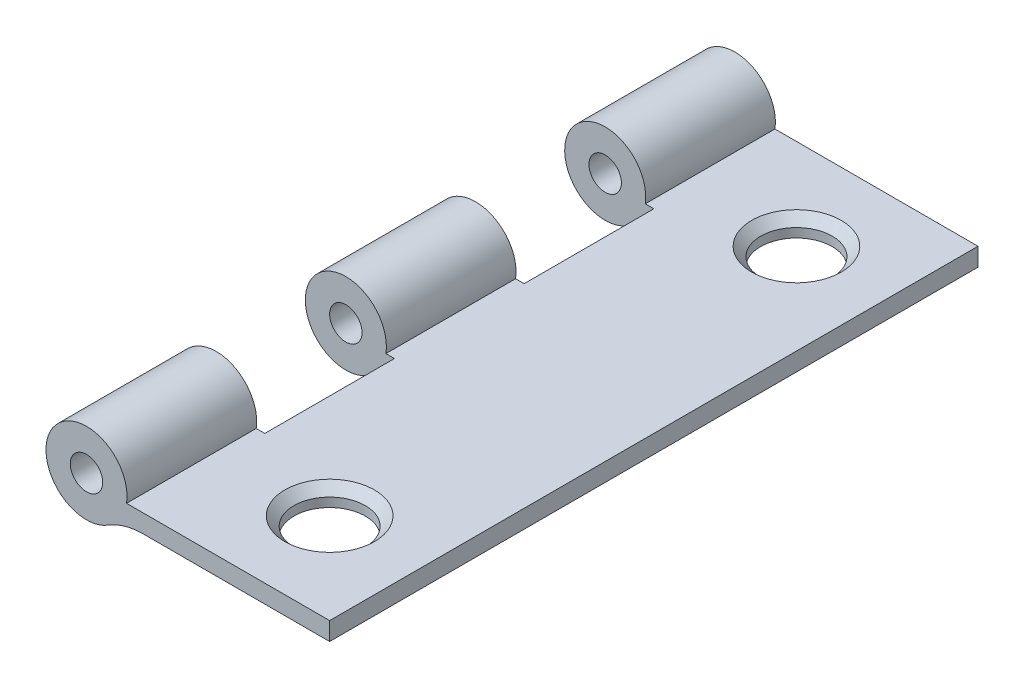
ISO-10303-21;
HEADER;
FILE_DESCRIPTION(('STEP AP214'),'2;1');
FILE_NAME('part.step','',(''),(''),'','','');
FILE_SCHEMA(('AUTOMOTIVE_DESIGN { 1 0 10303 214 1 1 1 1 }'));
ENDSEC;
DATA;
#1=APPLICATION_CONTEXT('core data for automotive mechanical design processes');
#2=APPLICATION_PROTOCOL_DEFINITION('international standard','automotive_design',2000,#1);
#3=PRODUCT_CONTEXT('',#1,'mechanical');
#4=PRODUCT('Part','Part','',(#3));
#5=PRODUCT_RELATED_PRODUCT_CATEGORY('part','',(#4));
#6=PRODUCT_DEFINITION_FORMATION('','',#4);
#7=PRODUCT_DEFINITION_CONTEXT('part definition',#1,'design');
#8=PRODUCT_DEFINITION('design','',#6,#7);
#9=PRODUCT_DEFINITION_SHAPE('','',#8);
#10=(LENGTH_UNIT() NAMED_UNIT(*) SI_UNIT(.MILLI.,.METRE.));
#11=(NAMED_UNIT(*) PLANE_ANGLE_UNIT() SI_UNIT($,.RADIAN.));
#12=(NAMED_UNIT(*) SI_UNIT($,.STERADIAN.) SOLID_ANGLE_UNIT());
#13=UNCERTAINTY_MEASURE_WITH_UNIT(LENGTH_MEASURE(1.E-05),#10,'distance_accuracy_value','');
#14=(GEOMETRIC_REPRESENTATION_CONTEXT(3) GLOBAL_UNCERTAINTY_ASSIGNED_CONTEXT((#13)) GLOBAL_UNIT_ASSIGNED_CONTEXT((#10,
#11,#12)) REPRESENTATION_CONTEXT('',''));
#15=CARTESIAN_POINT('',(0.,0.,0.));
#16=DIRECTION('',(0.,0.,1.));
#17=DIRECTION('',(1.,0.,0.));
#18=AXIS2_PLACEMENT_3D('',#15,#16,#17);
#19=CARTESIAN_POINT('',(0.,0.,25.4));
#20=DIRECTION('',(0.,0.,-1.));
#21=DIRECTION('',(-1.,0.,0.));
#22=AXIS2_PLACEMENT_3D('',#19,#20,#21);
#23=CYLINDRICAL_SURFACE('',#22,3.175);
#24=DIRECTION('',(0.,0.,-1.));
#25=VECTOR('',#24,1.);
#26=CARTESIAN_POINT('',(1.69208040431729,-2.68653846153846,25.4));
#27=LINE('',#26,#25);
#28=CARTESIAN_POINT('',(1.69208040431729,-2.68653846153846,-25.4));
#29=VERTEX_POINT('',#28);
#30=CARTESIAN_POINT('',(1.69208040431729,-2.68653846153846,-15.24));
#31=VERTEX_POINT('',#30);
#32=EDGE_CURVE('E214',#29,#31,#27,.F.);
#33=ORIENTED_EDGE('',*,*,#32,.T.);
#34=CARTESIAN_POINT('',(0.,0.,-15.24));
#35=DIRECTION('',(0.,0.,1.));
#36=DIRECTION('',(1.,0.,0.));
#37=AXIS2_PLACEMENT_3D('',#34,#35,#36);
#38=CIRCLE('',#37,3.175);
#39=CARTESIAN_POINT('',(3.13810806697284,-0.4826,-15.24));
#40=VERTEX_POINT('',#39);
#41=EDGE_CURVE('E170',#40,#31,#38,.T.);
#42=ORIENTED_EDGE('',*,*,#41,.F.);
#43=DIRECTION('',(0.,0.,-1.));
#44=VECTOR('',#43,1.);
#45=CARTESIAN_POINT('',(3.13810806697284,-0.4826,25.4));
#46=LINE('',#45,#44);
#47=CARTESIAN_POINT('',(3.13810806697284,-0.4826,-25.4));
#48=VERTEX_POINT('',#47);
#49=EDGE_CURVE('E192',#40,#48,#46,.T.);
#50=ORIENTED_EDGE('',*,*,#49,.T.);
#51=CARTESIAN_POINT('',(0.,0.,-25.4));
#52=DIRECTION('',(0.,0.,1.));
#53=DIRECTION('',(1.,0.,0.));
#54=AXIS2_PLACEMENT_3D('',#51,#52,#53);
#55=CIRCLE('',#54,3.175);
#56=EDGE_CURVE('E180',#48,#29,#55,.T.);
#57=ORIENTED_EDGE('',*,*,#56,.T.);
#58=EDGE_LOOP('',(#33,#42,#50,#57));
#59=FACE_BOUND('',#58,.T.);
#60=ADVANCED_FACE('F37',(#59),#23,.T.);
#61=CARTESIAN_POINT('',(0.,0.,-5.08));
#62=DIRECTION('',(0.,0.,1.));
#63=DIRECTION('',(1.,0.,0.));
#64=AXIS2_PLACEMENT_3D('',#61,#62,#63);
#65=CIRCLE('',#64,3.175);
#66=CARTESIAN_POINT('',(3.13810806697284,-0.4826,-5.08));
#67=VERTEX_POINT('',#66);
#68=CARTESIAN_POINT('',(1.69208040431729,-2.68653846153846,-5.08));
#69=VERTEX_POINT('',#68);
#70=EDGE_CURVE('E163',#67,#69,#65,.T.);
#71=ORIENTED_EDGE('',*,*,#70,.T.);
#72=CARTESIAN_POINT('',(1.69208040431729,-2.68653846153846,5.08));
#73=VERTEX_POINT('',#72);
#74=EDGE_CURVE('E218',#69,#73,#27,.F.);
#75=ORIENTED_EDGE('',*,*,#74,.T.);
#76=CARTESIAN_POINT('',(0.,0.,5.08));
#77=DIRECTION('',(0.,0.,1.));
#78=DIRECTION('',(1.,0.,0.));
#79=AXIS2_PLACEMENT_3D('',#76,#77,#78);
#80=CIRCLE('',#79,3.175);
#81=CARTESIAN_POINT('',(3.13810806697284,-0.4826,5.08));
#82=VERTEX_POINT('',#81);
#83=EDGE_CURVE('E157',#82,#73,#80,.T.);
#84=ORIENTED_EDGE('',*,*,#83,.F.);
#85=EDGE_CURVE('E205',#82,#67,#46,.T.);
#86=ORIENTED_EDGE('',*,*,#85,.T.);
#87=EDGE_LOOP('',(#71,#75,#84,#86));
#88=FACE_BOUND('',#87,.T.);
#89=ADVANCED_FACE('F300',(#88),#23,.T.);
#90=CARTESIAN_POINT('',(0.,0.,15.24));
#91=DIRECTION('',(0.,0.,1.));
#92=DIRECTION('',(1.,0.,0.));
#93=AXIS2_PLACEMENT_3D('',#90,#91,#92);
#94=CIRCLE('',#93,3.175);
#95=CARTESIAN_POINT('',(3.13810806697284,-0.4826,15.24));
#96=VERTEX_POINT('',#95);
#97=CARTESIAN_POINT('',(1.69208040431729,-2.68653846153846,15.24));
#98=VERTEX_POINT('',#97);
#99=EDGE_CURVE('E135',#96,#98,#94,.T.);
#100=ORIENTED_EDGE('',*,*,#99,.T.);
#101=CARTESIAN_POINT('',(1.69208040431729,-2.68653846153846,25.4));
#102=VERTEX_POINT('',#101);
#103=EDGE_CURVE('E213',#98,#102,#27,.F.);
#104=ORIENTED_EDGE('',*,*,#103,.T.);
#105=CARTESIAN_POINT('',(0.,0.,25.4));
#106=DIRECTION('',(0.,0.,1.));
#107=DIRECTION('',(1.,0.,0.));
#108=AXIS2_PLACEMENT_3D('',#105,#106,#107);
#109=CIRCLE('',#108,3.175);
#110=CARTESIAN_POINT('',(3.13810806697284,-0.4826,25.4));
#111=VERTEX_POINT('',#110);
#112=EDGE_CURVE('E181',#111,#102,#109,.T.);
#113=ORIENTED_EDGE('',*,*,#112,.F.);
#114=EDGE_CURVE('E202',#111,#96,#46,.T.);
#115=ORIENTED_EDGE('',*,*,#114,.T.);
#116=EDGE_LOOP('',(#100,#104,#113,#115));
#117=FACE_BOUND('',#116,.T.);
#118=ADVANCED_FACE('F295',(#117),#23,.T.);
#119=CARTESIAN_POINT('',(0.,-0.4826,25.4));
#120=DIRECTION('',(0.,-1.,0.));
#121=DIRECTION('',(1.,0.,0.));
#122=AXIS2_PLACEMENT_3D('',#119,#120,#121);
#123=PLANE('',#122);
#124=CARTESIAN_POINT('',(11.9380000429728,-0.482599999999999,-18.288));
#125=DIRECTION('',(0.,-1.,0.));
#126=DIRECTION('',(1.,0.,0.));
#127=AXIS2_PLACEMENT_3D('',#124,#125,#126);
#128=CIRCLE('',#127,3.5112);
#129=CARTESIAN_POINT('',(15.4492000429728,-0.482599999999998,-18.288));
#130=VERTEX_POINT('',#129);
#131=EDGE_CURVE('E46',#130,#130,#128,.T.);
#132=ORIENTED_EDGE('',*,*,#131,.T.);
#133=EDGE_LOOP('',(#132));
#134=FACE_BOUND('',#133,.T.);
#135=CARTESIAN_POINT('',(11.9380000429728,-0.482599999999999,18.288));
#136=DIRECTION('',(0.,-1.,0.));
#137=DIRECTION('',(1.,0.,0.));
#138=AXIS2_PLACEMENT_3D('',#135,#136,#137);
#139=CIRCLE('',#138,3.5112);
#140=CARTESIAN_POINT('',(15.4492000429728,-0.482599999999998,18.288));
#141=VERTEX_POINT('',#140);
#142=EDGE_CURVE('E242',#141,#141,#139,.T.);
#143=ORIENTED_EDGE('',*,*,#142,.T.);
#144=EDGE_LOOP('',(#143));
#145=FACE_BOUND('',#144,.T.);
#146=DIRECTION('',(-1.,0.,0.));
#147=VECTOR('',#146,1.);
#148=CARTESIAN_POINT('',(0.,-0.4826,-15.24));
#149=LINE('',#148,#147);
#150=CARTESIAN_POINT('',(3.81,-0.4826,-15.24));
#151=VERTEX_POINT('',#150);
#152=EDGE_CURVE('E172',#151,#40,#149,.T.);
#153=ORIENTED_EDGE('',*,*,#152,.F.);
#154=DIRECTION('',(0.,0.,-1.));
#155=VECTOR('',#154,1.);
#156=CARTESIAN_POINT('',(3.81000000000001,-0.4826,25.4));
#157=LINE('',#156,#155);
#158=CARTESIAN_POINT('',(3.81,-0.4826,-5.08));
#159=VERTEX_POINT('',#158);
#160=EDGE_CURVE('E168',#159,#151,#157,.T.);
#161=ORIENTED_EDGE('',*,*,#160,.F.);
#162=DIRECTION('',(-1.,0.,0.));
#163=VECTOR('',#162,1.);
#164=CARTESIAN_POINT('',(0.,-0.4826,-5.08));
#165=LINE('',#164,#163);
#166=EDGE_CURVE('E165',#159,#67,#165,.T.);
#167=ORIENTED_EDGE('',*,*,#166,.T.);
#168=ORIENTED_EDGE('',*,*,#85,.F.);
#169=DIRECTION('',(-1.,0.,0.));
#170=VECTOR('',#169,1.);
#171=CARTESIAN_POINT('',(0.,-0.4826,5.08));
#172=LINE('',#171,#170);
#173=CARTESIAN_POINT('',(3.81,-0.4826,5.08));
#174=VERTEX_POINT('',#173);
#175=EDGE_CURVE('E156',#174,#82,#172,.T.);
#176=ORIENTED_EDGE('',*,*,#175,.F.);
#177=DIRECTION('',(0.,0.,-1.));
#178=VECTOR('',#177,1.);
#179=CARTESIAN_POINT('',(3.81000000000001,-0.4826,25.4));
#180=LINE('',#179,#178);
#181=CARTESIAN_POINT('',(3.81,-0.4826,15.24));
#182=VERTEX_POINT('',#181);
#183=EDGE_CURVE('E140',#182,#174,#180,.T.);
#184=ORIENTED_EDGE('',*,*,#183,.F.);
#185=DIRECTION('',(-1.,0.,0.));
#186=VECTOR('',#185,1.);
#187=CARTESIAN_POINT('',(0.,-0.4826,15.24));
#188=LINE('',#187,#186);
#189=EDGE_CURVE('E133',#182,#96,#188,.T.);
#190=ORIENTED_EDGE('',*,*,#189,.T.);
#191=ORIENTED_EDGE('',*,*,#114,.F.);
#192=DIRECTION('',(-1.,0.,0.));
#193=VECTOR('',#192,1.);
#194=CARTESIAN_POINT('',(0.,-0.4826,25.4));
#195=LINE('',#194,#193);
#196=CARTESIAN_POINT('',(19.0500000429728,-0.482599999999998,25.4));
#197=VERTEX_POINT('',#196);
#198=EDGE_CURVE('E190',#197,#111,#195,.T.);
#199=ORIENTED_EDGE('',*,*,#198,.F.);
#200=DIRECTION('',(0.,0.,-1.));
#201=VECTOR('',#200,1.);
#202=CARTESIAN_POINT('',(19.0500000429728,-0.482599999999998,25.4));
#203=LINE('',#202,#201);
#204=CARTESIAN_POINT('',(19.0500000429728,-0.482599999999998,-25.4));
#205=VERTEX_POINT('',#204);
#206=EDGE_CURVE('E204',#197,#205,#203,.T.);
#207=ORIENTED_EDGE('',*,*,#206,.T.);
#208=DIRECTION('',(-1.,0.,0.));
#209=VECTOR('',#208,1.);
#210=CARTESIAN_POINT('',(0.,-0.4826,-25.4));
#211=LINE('',#210,#209);
#212=EDGE_CURVE('E185',#205,#48,#211,.T.);
#213=ORIENTED_EDGE('',*,*,#212,.T.);
#214=ORIENTED_EDGE('',*,*,#49,.F.);
#215=EDGE_LOOP('',(#153,#161,#167,#168,#176,#184,#190,#191,#199,#207,#213,#214));
#216=FACE_BOUND('',#215,.T.);
#217=ADVANCED_FACE('F154',(#134,#145,#216),#123,.F.);
#218=CARTESIAN_POINT('',(4.39940905122495,-6.985,25.4));
#219=DIRECTION('',(0.,0.,-1.));
#220=DIRECTION('',(-1.,0.,0.));
#221=AXIS2_PLACEMENT_3D('',#218,#219,#220);
#222=CYLINDRICAL_SURFACE('',#221,5.08);
#223=CARTESIAN_POINT('',(4.39940905122495,-6.985,-15.24));
#224=DIRECTION('',(0.,0.,1.));
#225=DIRECTION('',(1.,0.,0.));
#226=AXIS2_PLACEMENT_3D('',#223,#224,#225);
#227=CIRCLE('',#226,5.08);
#228=CARTESIAN_POINT('',(3.81,-1.93930906908339,-15.24));
#229=VERTEX_POINT('',#228);
#230=EDGE_CURVE('E232',#31,#229,#227,.F.);
#231=ORIENTED_EDGE('',*,*,#230,.F.);
#232=ORIENTED_EDGE('',*,*,#32,.F.);
#233=CARTESIAN_POINT('',(4.39940905122495,-6.985,-25.4));
#234=DIRECTION('',(0.,0.,1.));
#235=DIRECTION('',(1.,0.,0.));
#236=AXIS2_PLACEMENT_3D('',#233,#234,#235);
#237=CIRCLE('',#236,5.08);
#238=CARTESIAN_POINT('',(4.39940905122495,-1.905,-25.4));
#239=VERTEX_POINT('',#238);
#240=EDGE_CURVE('E217',#239,#29,#237,.T.);
#241=ORIENTED_EDGE('',*,*,#240,.F.);
#242=DIRECTION('',(0.,0.,-1.));
#243=VECTOR('',#242,1.);
#244=CARTESIAN_POINT('',(4.39940905122495,-1.905,25.4));
#245=LINE('',#244,#243);
#246=CARTESIAN_POINT('',(4.39940905122495,-1.905,25.4));
#247=VERTEX_POINT('',#246);
#248=EDGE_CURVE('E210',#247,#239,#245,.T.);
#249=ORIENTED_EDGE('',*,*,#248,.F.);
#250=CARTESIAN_POINT('',(4.39940905122495,-6.985,25.4));
#251=DIRECTION('',(0.,0.,1.));
#252=DIRECTION('',(1.,0.,0.));
#253=AXIS2_PLACEMENT_3D('',#250,#251,#252);
#254=CIRCLE('',#253,5.08);
#255=EDGE_CURVE('E220',#102,#247,#254,.F.);
#256=ORIENTED_EDGE('',*,*,#255,.F.);
#257=ORIENTED_EDGE('',*,*,#103,.F.);
#258=CARTESIAN_POINT('',(4.39940905122495,-6.985,15.24));
#259=DIRECTION('',(0.,0.,1.));
#260=DIRECTION('',(1.,0.,0.));
#261=AXIS2_PLACEMENT_3D('',#258,#259,#260);
#262=CIRCLE('',#261,5.08);
#263=CARTESIAN_POINT('',(3.81,-1.93930906908339,15.24));
#264=VERTEX_POINT('',#263);
#265=EDGE_CURVE('E222',#98,#264,#262,.F.);
#266=ORIENTED_EDGE('',*,*,#265,.T.);
#267=DIRECTION('',(0.,0.,-1.));
#268=VECTOR('',#267,1.);
#269=CARTESIAN_POINT('',(3.81000000000001,-1.93930906908339,25.4));
#270=LINE('',#269,#268);
#271=CARTESIAN_POINT('',(3.81,-1.93930906908339,5.08));
#272=VERTEX_POINT('',#271);
#273=EDGE_CURVE('E147',#272,#264,#270,.F.);
#274=ORIENTED_EDGE('',*,*,#273,.F.);
#275=CARTESIAN_POINT('',(4.39940905122495,-6.985,5.08));
#276=DIRECTION('',(0.,0.,1.));
#277=DIRECTION('',(1.,0.,0.));
#278=AXIS2_PLACEMENT_3D('',#275,#276,#277);
#279=CIRCLE('',#278,5.08);
#280=EDGE_CURVE('E225',#73,#272,#279,.F.);
#281=ORIENTED_EDGE('',*,*,#280,.F.);
#282=ORIENTED_EDGE('',*,*,#74,.F.);
#283=CARTESIAN_POINT('',(4.39940905122495,-6.985,-5.08));
#284=DIRECTION('',(0.,0.,1.));
#285=DIRECTION('',(1.,0.,0.));
#286=AXIS2_PLACEMENT_3D('',#283,#284,#285);
#287=CIRCLE('',#286,5.08);
#288=CARTESIAN_POINT('',(3.81,-1.93930906908339,-5.08));
#289=VERTEX_POINT('',#288);
#290=EDGE_CURVE('E227',#69,#289,#287,.F.);
#291=ORIENTED_EDGE('',*,*,#290,.T.);
#292=DIRECTION('',(0.,0.,-1.));
#293=VECTOR('',#292,1.);
#294=CARTESIAN_POINT('',(3.81000000000001,-1.93930906908339,25.4));
#295=LINE('',#294,#293);
#296=EDGE_CURVE('E230',#229,#289,#295,.F.);
#297=ORIENTED_EDGE('',*,*,#296,.F.);
#298=EDGE_LOOP('',(#231,#232,#241,#249,#256,#257,#266,#274,#281,#282,#291,#297));
#299=FACE_BOUND('',#298,.T.);
#300=ADVANCED_FACE('F267',(#299),#222,.F.);
#301=CARTESIAN_POINT('',(0.,-1.905,25.4));
#302=DIRECTION('',(0.,-1.,0.));
#303=DIRECTION('',(1.,0.,0.));
#304=AXIS2_PLACEMENT_3D('',#301,#302,#303);
#305=PLANE('',#304);
#306=CARTESIAN_POINT('',(11.9380000429728,-1.905,-18.288));
#307=DIRECTION('',(0.,-1.,0.));
#308=DIRECTION('',(1.,0.,0.));
#309=AXIS2_PLACEMENT_3D('',#306,#307,#308);
#310=CIRCLE('',#309,2.8);
#311=CARTESIAN_POINT('',(14.7380000429728,-1.905,-18.288));
#312=VERTEX_POINT('',#311);
#313=EDGE_CURVE('E174',#312,#312,#310,.T.);
#314=ORIENTED_EDGE('',*,*,#313,.F.);
#315=EDGE_LOOP('',(#314));
#316=FACE_BOUND('',#315,.T.);
#317=CARTESIAN_POINT('',(11.9380000429728,-1.905,18.288));
#318=DIRECTION('',(0.,-1.,0.));
#319=DIRECTION('',(1.,0.,0.));
#320=AXIS2_PLACEMENT_3D('',#317,#318,#319);
#321=CIRCLE('',#320,2.8);
#322=CARTESIAN_POINT('',(14.7380000429728,-1.905,18.288));
#323=VERTEX_POINT('',#322);
#324=EDGE_CURVE('E177',#323,#323,#321,.T.);
#325=ORIENTED_EDGE('',*,*,#324,.F.);
#326=EDGE_LOOP('',(#325));
#327=FACE_BOUND('',#326,.T.);
#328=DIRECTION('',(-1.,0.,0.));
#329=VECTOR('',#328,1.);
#330=CARTESIAN_POINT('',(0.,-1.905,25.4));
#331=LINE('',#330,#329);
#332=CARTESIAN_POINT('',(19.0500000429728,-1.905,25.4));
#333=VERTEX_POINT('',#332);
#334=EDGE_CURVE('E184',#333,#247,#331,.T.);
#335=ORIENTED_EDGE('',*,*,#334,.T.);
#336=ORIENTED_EDGE('',*,*,#248,.T.);
#337=DIRECTION('',(-1.,0.,0.));
#338=VECTOR('',#337,1.);
#339=CARTESIAN_POINT('',(0.,-1.905,-25.4));
#340=LINE('',#339,#338);
#341=CARTESIAN_POINT('',(19.0500000429728,-1.905,-25.4));
#342=VERTEX_POINT('',#341);
#343=EDGE_CURVE('E195',#342,#239,#340,.T.);
#344=ORIENTED_EDGE('',*,*,#343,.F.);
#345=DIRECTION('',(0.,0.,-1.));
#346=VECTOR('',#345,1.);
#347=CARTESIAN_POINT('',(19.0500000429728,-1.905,25.4));
#348=LINE('',#347,#346);
#349=EDGE_CURVE('E208',#333,#342,#348,.T.);
#350=ORIENTED_EDGE('',*,*,#349,.F.);
#351=EDGE_LOOP('',(#335,#336,#344,#350));
#352=FACE_BOUND('',#351,.T.);
#353=ADVANCED_FACE('F263',(#316,#327,#352),#305,.T.);
#354=CARTESIAN_POINT('',(19.0500000429728,0.,25.4));
#355=DIRECTION('',(-1.,0.,0.));
#356=DIRECTION('',(0.,0.,1.));
#357=AXIS2_PLACEMENT_3D('',#354,#355,#356);
#358=PLANE('',#357);
#359=DIRECTION('',(0.,1.,0.));
#360=VECTOR('',#359,1.);
#361=CARTESIAN_POINT('',(19.0500000429728,0.,-25.4));
#362=LINE('',#361,#360);
#363=EDGE_CURVE('E198',#342,#205,#362,.T.);
#364=ORIENTED_EDGE('',*,*,#363,.T.);
#365=ORIENTED_EDGE('',*,*,#206,.F.);
#366=DIRECTION('',(0.,1.,0.));
#367=VECTOR('',#366,1.);
#368=CARTESIAN_POINT('',(19.0500000429728,0.,25.4));
#369=LINE('',#368,#367);
#370=EDGE_CURVE('E188',#333,#197,#369,.T.);
#371=ORIENTED_EDGE('',*,*,#370,.F.);
#372=ORIENTED_EDGE('',*,*,#349,.T.);
#373=EDGE_LOOP('',(#364,#365,#371,#372));
#374=FACE_BOUND('',#373,.T.);
#375=ADVANCED_FACE('F266',(#374),#358,.F.);
#376=CARTESIAN_POINT('',(0.,0.,25.4));
#377=DIRECTION('',(0.,0.,1.));
#378=DIRECTION('',(1.,0.,0.));
#379=AXIS2_PLACEMENT_3D('',#376,#377,#378);
#380=PLANE('',#379);
#381=CARTESIAN_POINT('',(0.,0.,25.4));
#382=DIRECTION('',(0.,0.,1.));
#383=DIRECTION('',(1.,0.,0.));
#384=AXIS2_PLACEMENT_3D('',#381,#382,#383);
#385=CIRCLE('',#384,1.27);
#386=CARTESIAN_POINT('',(1.27,0.,25.4));
#387=VERTEX_POINT('',#386);
#388=EDGE_CURVE('E320',#387,#387,#385,.T.);
#389=ORIENTED_EDGE('',*,*,#388,.F.);
#390=EDGE_LOOP('',(#389));
#391=FACE_BOUND('',#390,.T.);
#392=ORIENTED_EDGE('',*,*,#112,.T.);
#393=ORIENTED_EDGE('',*,*,#255,.T.);
#394=ORIENTED_EDGE('',*,*,#334,.F.);
#395=ORIENTED_EDGE('',*,*,#370,.T.);
#396=ORIENTED_EDGE('',*,*,#198,.T.);
#397=EDGE_LOOP('',(#392,#393,#394,#395,#396));
#398=FACE_BOUND('',#397,.T.);
#399=ADVANCED_FACE('F292',(#391,#398),#380,.T.);
#400=CARTESIAN_POINT('',(0.,0.,-25.4));
#401=DIRECTION('',(0.,0.,1.));
#402=DIRECTION('',(1.,0.,0.));
#403=AXIS2_PLACEMENT_3D('',#400,#401,#402);
#404=PLANE('',#403);
#405=CARTESIAN_POINT('',(0.,0.,-25.4));
#406=DIRECTION('',(0.,0.,1.));
#407=DIRECTION('',(1.,0.,0.));
#408=AXIS2_PLACEMENT_3D('',#405,#406,#407);
#409=CIRCLE('',#408,1.27);
#410=CARTESIAN_POINT('',(1.27,0.,-25.4));
#411=VERTEX_POINT('',#410);
#412=EDGE_CURVE('E239',#411,#411,#409,.T.);
#413=ORIENTED_EDGE('',*,*,#412,.T.);
#414=EDGE_LOOP('',(#413));
#415=FACE_BOUND('',#414,.T.);
#416=ORIENTED_EDGE('',*,*,#56,.F.);
#417=ORIENTED_EDGE('',*,*,#212,.F.);
#418=ORIENTED_EDGE('',*,*,#363,.F.);
#419=ORIENTED_EDGE('',*,*,#343,.T.);
#420=ORIENTED_EDGE('',*,*,#240,.T.);
#421=EDGE_LOOP('',(#416,#417,#418,#419,#420));
#422=FACE_BOUND('',#421,.T.);
#423=ADVANCED_FACE('F283',(#415,#422),#404,.F.);
#424=CARTESIAN_POINT('',(11.9380000429728,-0.482599999999999,18.288));
#425=DIRECTION('',(0.,1.,0.));
#426=DIRECTION('',(0.,0.,1.));
#427=AXIS2_PLACEMENT_3D('',#424,#425,#426);
#428=CYLINDRICAL_SURFACE('',#427,2.8);
#429=CARTESIAN_POINT('',(11.9380000429728,-1.19379999999999,18.288));
#430=DIRECTION('',(0.,-1.,0.));
#431=DIRECTION('',(0.,0.,-1.));
#432=AXIS2_PLACEMENT_3D('',#429,#430,#431);
#433=CIRCLE('',#432,2.8);
#434=CARTESIAN_POINT('',(11.9380000429728,-1.19379999999999,15.488));
#435=VERTEX_POINT('',#434);
#436=EDGE_CURVE('E11',#435,#435,#433,.F.);
#437=ORIENTED_EDGE('',*,*,#436,.T.);
#438=EDGE_LOOP('',(#437));
#439=FACE_BOUND('',#438,.T.);
#440=ORIENTED_EDGE('',*,*,#324,.T.);
#441=EDGE_LOOP('',(#440));
#442=FACE_BOUND('',#441,.T.);
#443=ADVANCED_FACE('F259',(#439,#442),#428,.F.);
#444=CARTESIAN_POINT('',(11.9380000429728,-0.482599999999999,-18.288));
#445=DIRECTION('',(0.,1.,0.));
#446=DIRECTION('',(0.,0.,1.));
#447=AXIS2_PLACEMENT_3D('',#444,#445,#446);
#448=CYLINDRICAL_SURFACE('',#447,2.8);
#449=CARTESIAN_POINT('',(11.9380000429728,-1.19379999999999,-18.288));
#450=DIRECTION('',(0.,-1.,0.));
#451=DIRECTION('',(0.,0.,-1.));
#452=AXIS2_PLACEMENT_3D('',#449,#450,#451);
#453=CIRCLE('',#452,2.8);
#454=CARTESIAN_POINT('',(11.9380000429728,-1.19379999999999,-21.088));
#455=VERTEX_POINT('',#454);
#456=EDGE_CURVE('E234',#455,#455,#453,.F.);
#457=ORIENTED_EDGE('',*,*,#456,.T.);
#458=EDGE_LOOP('',(#457));
#459=FACE_BOUND('',#458,.T.);
#460=ORIENTED_EDGE('',*,*,#313,.T.);
#461=EDGE_LOOP('',(#460));
#462=FACE_BOUND('',#461,.T.);
#463=ADVANCED_FACE('F255',(#459,#462),#448,.F.);
#464=CARTESIAN_POINT('',(0.,-3.175,5.08));
#465=DIRECTION('',(0.,0.,1.));
#466=DIRECTION('',(1.,0.,0.));
#467=AXIS2_PLACEMENT_3D('',#464,#465,#466);
#468=PLANE('',#467);
#469=CARTESIAN_POINT('',(0.,0.,5.08));
#470=DIRECTION('',(0.,0.,1.));
#471=DIRECTION('',(1.,0.,0.));
#472=AXIS2_PLACEMENT_3D('',#469,#470,#471);
#473=CIRCLE('',#472,1.27);
#474=CARTESIAN_POINT('',(1.27,0.,5.08));
#475=VERTEX_POINT('',#474);
#476=EDGE_CURVE('E150',#475,#475,#473,.T.);
#477=ORIENTED_EDGE('',*,*,#476,.F.);
#478=EDGE_LOOP('',(#477));
#479=FACE_BOUND('',#478,.T.);
#480=ORIENTED_EDGE('',*,*,#175,.T.);
#481=ORIENTED_EDGE('',*,*,#83,.T.);
#482=ORIENTED_EDGE('',*,*,#280,.T.);
#483=DIRECTION('',(0.,1.,0.));
#484=VECTOR('',#483,1.);
#485=CARTESIAN_POINT('',(3.81,-3.175,5.08));
#486=LINE('',#485,#484);
#487=EDGE_CURVE('E149',#272,#174,#486,.T.);
#488=ORIENTED_EDGE('',*,*,#487,.T.);
#489=EDGE_LOOP('',(#480,#481,#482,#488));
#490=FACE_BOUND('',#489,.T.);
#491=ADVANCED_FACE('F258',(#479,#490),#468,.T.);
#492=CARTESIAN_POINT('',(3.81,-3.175,0.));
#493=DIRECTION('',(-1.,0.,0.));
#494=DIRECTION('',(0.,0.,1.));
#495=AXIS2_PLACEMENT_3D('',#492,#493,#494);
#496=PLANE('',#495);
#497=ORIENTED_EDGE('',*,*,#183,.T.);
#498=ORIENTED_EDGE('',*,*,#487,.F.);
#499=ORIENTED_EDGE('',*,*,#273,.T.);
#500=DIRECTION('',(0.,1.,0.));
#501=VECTOR('',#500,1.);
#502=CARTESIAN_POINT('',(3.81,-3.175,15.24));
#503=LINE('',#502,#501);
#504=EDGE_CURVE('E61',#264,#182,#503,.T.);
#505=ORIENTED_EDGE('',*,*,#504,.T.);
#506=EDGE_LOOP('',(#497,#498,#499,#505));
#507=FACE_BOUND('',#506,.T.);
#508=ADVANCED_FACE('F143',(#507),#496,.T.);
#509=CARTESIAN_POINT('',(0.,-3.175,15.24));
#510=DIRECTION('',(0.,0.,1.));
#511=DIRECTION('',(1.,0.,0.));
#512=AXIS2_PLACEMENT_3D('',#509,#510,#511);
#513=PLANE('',#512);
#514=CARTESIAN_POINT('',(0.,0.,15.24));
#515=DIRECTION('',(0.,0.,1.));
#516=DIRECTION('',(1.,0.,0.));
#517=AXIS2_PLACEMENT_3D('',#514,#515,#516);
#518=CIRCLE('',#517,1.27);
#519=CARTESIAN_POINT('',(1.27,0.,15.24));
#520=VERTEX_POINT('',#519);
#521=EDGE_CURVE('E315',#520,#520,#518,.T.);
#522=ORIENTED_EDGE('',*,*,#521,.T.);
#523=EDGE_LOOP('',(#522));
#524=FACE_BOUND('',#523,.T.);
#525=ORIENTED_EDGE('',*,*,#504,.F.);
#526=ORIENTED_EDGE('',*,*,#265,.F.);
#527=ORIENTED_EDGE('',*,*,#99,.F.);
#528=ORIENTED_EDGE('',*,*,#189,.F.);
#529=EDGE_LOOP('',(#525,#526,#527,#528));
#530=FACE_BOUND('',#529,.T.);
#531=ADVANCED_FACE('F134',(#524,#530),#513,.F.);
#532=CARTESIAN_POINT('',(0.,-3.175,-15.24));
#533=DIRECTION('',(0.,0.,1.));
#534=DIRECTION('',(1.,0.,0.));
#535=AXIS2_PLACEMENT_3D('',#532,#533,#534);
#536=PLANE('',#535);
#537=CARTESIAN_POINT('',(0.,0.,-15.24));
#538=DIRECTION('',(0.,0.,1.));
#539=DIRECTION('',(1.,0.,0.));
#540=AXIS2_PLACEMENT_3D('',#537,#538,#539);
#541=CIRCLE('',#540,1.27);
#542=CARTESIAN_POINT('',(1.27,0.,-15.24));
#543=VERTEX_POINT('',#542);
#544=EDGE_CURVE('E238',#543,#543,#541,.T.);
#545=ORIENTED_EDGE('',*,*,#544,.F.);
#546=EDGE_LOOP('',(#545));
#547=FACE_BOUND('',#546,.T.);
#548=ORIENTED_EDGE('',*,*,#152,.T.);
#549=ORIENTED_EDGE('',*,*,#41,.T.);
#550=ORIENTED_EDGE('',*,*,#230,.T.);
#551=DIRECTION('',(0.,1.,0.));
#552=VECTOR('',#551,1.);
#553=CARTESIAN_POINT('',(3.81,-3.175,-15.24));
#554=LINE('',#553,#552);
#555=EDGE_CURVE('E306',#229,#151,#554,.T.);
#556=ORIENTED_EDGE('',*,*,#555,.T.);
#557=EDGE_LOOP('',(#548,#549,#550,#556));
#558=FACE_BOUND('',#557,.T.);
#559=ADVANCED_FACE('F373',(#547,#558),#536,.T.);
#560=CARTESIAN_POINT('',(3.81,-3.175,0.));
#561=DIRECTION('',(-1.,0.,0.));
#562=DIRECTION('',(0.,0.,1.));
#563=AXIS2_PLACEMENT_3D('',#560,#561,#562);
#564=PLANE('',#563);
#565=ORIENTED_EDGE('',*,*,#160,.T.);
#566=ORIENTED_EDGE('',*,*,#555,.F.);
#567=ORIENTED_EDGE('',*,*,#296,.T.);
#568=DIRECTION('',(0.,1.,0.));
#569=VECTOR('',#568,1.);
#570=CARTESIAN_POINT('',(3.81,-3.175,-5.08));
#571=LINE('',#570,#569);
#572=EDGE_CURVE('E53',#289,#159,#571,.T.);
#573=ORIENTED_EDGE('',*,*,#572,.T.);
#574=EDGE_LOOP('',(#565,#566,#567,#573));
#575=FACE_BOUND('',#574,.T.);
#576=ADVANCED_FACE('F382',(#575),#564,.T.);
#577=CARTESIAN_POINT('',(0.,-3.175,-5.08));
#578=DIRECTION('',(0.,0.,1.));
#579=DIRECTION('',(1.,0.,0.));
#580=AXIS2_PLACEMENT_3D('',#577,#578,#579);
#581=PLANE('',#580);
#582=CARTESIAN_POINT('',(0.,0.,-5.08));
#583=DIRECTION('',(0.,0.,1.));
#584=DIRECTION('',(1.,0.,0.));
#585=AXIS2_PLACEMENT_3D('',#582,#583,#584);
#586=CIRCLE('',#585,1.27);
#587=CARTESIAN_POINT('',(1.27,0.,-5.08));
#588=VERTEX_POINT('',#587);
#589=EDGE_CURVE('E235',#588,#588,#586,.T.);
#590=ORIENTED_EDGE('',*,*,#589,.T.);
#591=EDGE_LOOP('',(#590));
#592=FACE_BOUND('',#591,.T.);
#593=ORIENTED_EDGE('',*,*,#572,.F.);
#594=ORIENTED_EDGE('',*,*,#290,.F.);
#595=ORIENTED_EDGE('',*,*,#70,.F.);
#596=ORIENTED_EDGE('',*,*,#166,.F.);
#597=EDGE_LOOP('',(#593,#594,#595,#596));
#598=FACE_BOUND('',#597,.T.);
#599=ADVANCED_FACE('F337',(#592,#598),#581,.F.);
#600=CARTESIAN_POINT('',(0.,0.,-25.4));
#601=DIRECTION('',(0.,0.,1.));
#602=DIRECTION('',(1.,0.,0.));
#603=AXIS2_PLACEMENT_3D('',#600,#601,#602);
#604=CYLINDRICAL_SURFACE('',#603,1.27);
#605=ORIENTED_EDGE('',*,*,#476,.T.);
#606=EDGE_LOOP('',(#605));
#607=FACE_BOUND('',#606,.T.);
#608=ORIENTED_EDGE('',*,*,#589,.F.);
#609=EDGE_LOOP('',(#608));
#610=FACE_BOUND('',#609,.T.);
#611=ADVANCED_FACE('F329',(#607,#610),#604,.F.);
#612=ORIENTED_EDGE('',*,*,#544,.T.);
#613=EDGE_LOOP('',(#612));
#614=FACE_BOUND('',#613,.T.);
#615=ORIENTED_EDGE('',*,*,#412,.F.);
#616=EDGE_LOOP('',(#615));
#617=FACE_BOUND('',#616,.T.);
#618=ADVANCED_FACE('F327',(#614,#617),#604,.F.);
#619=ORIENTED_EDGE('',*,*,#388,.T.);
#620=EDGE_LOOP('',(#619));
#621=FACE_BOUND('',#620,.T.);
#622=ORIENTED_EDGE('',*,*,#521,.F.);
#623=EDGE_LOOP('',(#622));
#624=FACE_BOUND('',#623,.T.);
#625=ADVANCED_FACE('F252',(#621,#624),#604,.F.);
#626=CARTESIAN_POINT('',(11.9380000429728,-1.19379999999999,-18.288));
#627=DIRECTION('',(0.,1.,0.));
#628=DIRECTION('',(0.,0.,1.));
#629=AXIS2_PLACEMENT_3D('',#626,#627,#628);
#630=CONICAL_SURFACE('',#629,2.8,0.785398163397451);
#631=ORIENTED_EDGE('',*,*,#131,.F.);
#632=EDGE_LOOP('',(#631));
#633=FACE_BOUND('',#632,.T.);
#634=ORIENTED_EDGE('',*,*,#456,.F.);
#635=EDGE_LOOP('',(#634));
#636=FACE_BOUND('',#635,.T.);
#637=ADVANCED_FACE('F249',(#633,#636),#630,.F.);
#638=CARTESIAN_POINT('',(11.9380000429728,-1.19379999999999,18.288));
#639=DIRECTION('',(0.,1.,0.));
#640=DIRECTION('',(0.,0.,1.));
#641=AXIS2_PLACEMENT_3D('',#638,#639,#640);
#642=CONICAL_SURFACE('',#641,2.8,0.78539816339745);
#643=ORIENTED_EDGE('',*,*,#142,.F.);
#644=EDGE_LOOP('',(#643));
#645=FACE_BOUND('',#644,.T.);
#646=ORIENTED_EDGE('',*,*,#436,.F.);
#647=EDGE_LOOP('',(#646));
#648=FACE_BOUND('',#647,.T.);
#649=ADVANCED_FACE('F40',(#645,#648),#642,.F.);
#650=CLOSED_SHELL('',(#60,#89,#118,#217,#300,#353,#375,#399,#423,#443,#463,#491,#508,#531,#559,
#576,#599,#611,#618,#625,#637,#649));
#651=MANIFOLD_SOLID_BREP('B2',#650);
#652=ADVANCED_BREP_SHAPE_REPRESENTATION('',(#18,#651),#14);
#653=SHAPE_DEFINITION_REPRESENTATION(#9,#652);
ENDSEC;
END-ISO-10303-21;
